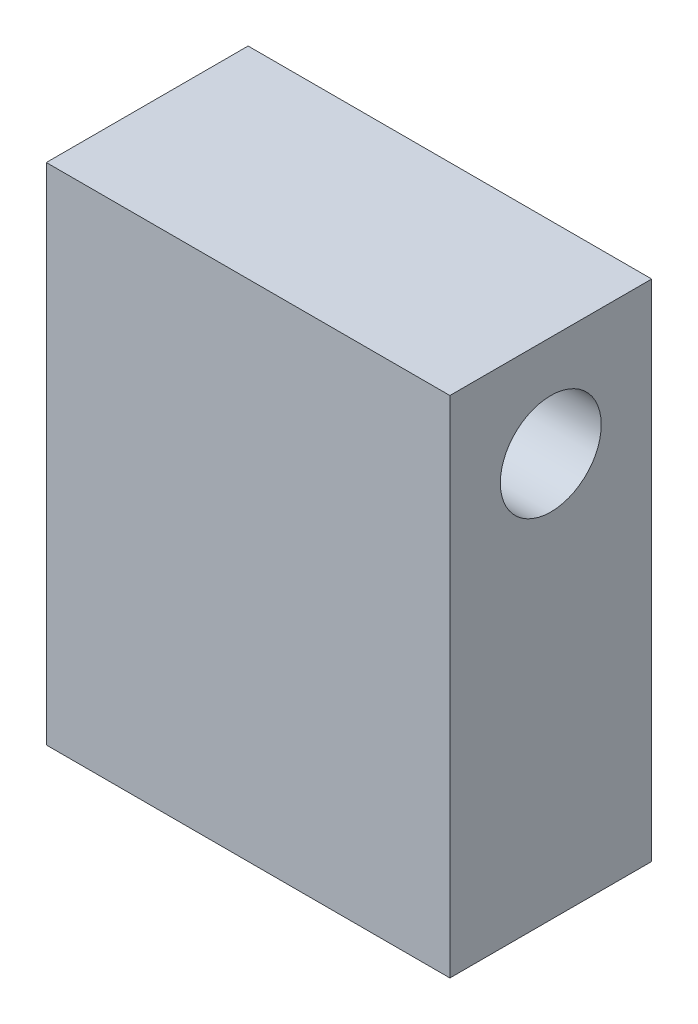
ISO-10303-21;
HEADER;
FILE_DESCRIPTION(('STEP AP214'),'2;1');
FILE_NAME('part.step','',(''),(''),'','','');
FILE_SCHEMA(('AUTOMOTIVE_DESIGN { 1 0 10303 214 1 1 1 1 }'));
ENDSEC;
DATA;
#1=APPLICATION_CONTEXT('core data for automotive mechanical design processes');
#2=APPLICATION_PROTOCOL_DEFINITION('international standard','automotive_design',2000,#1);
#3=PRODUCT_CONTEXT('',#1,'mechanical');
#4=PRODUCT('Part','Part','',(#3));
#5=PRODUCT_RELATED_PRODUCT_CATEGORY('part','',(#4));
#6=PRODUCT_DEFINITION_FORMATION('','',#4);
#7=PRODUCT_DEFINITION_CONTEXT('part definition',#1,'design');
#8=PRODUCT_DEFINITION('design','',#6,#7);
#9=PRODUCT_DEFINITION_SHAPE('','',#8);
#10=(LENGTH_UNIT() NAMED_UNIT(*) SI_UNIT(.MILLI.,.METRE.));
#11=(NAMED_UNIT(*) PLANE_ANGLE_UNIT() SI_UNIT($,.RADIAN.));
#12=(NAMED_UNIT(*) SI_UNIT($,.STERADIAN.) SOLID_ANGLE_UNIT());
#13=UNCERTAINTY_MEASURE_WITH_UNIT(LENGTH_MEASURE(1.E-05),#10,'distance_accuracy_value','');
#14=(GEOMETRIC_REPRESENTATION_CONTEXT(3) GLOBAL_UNCERTAINTY_ASSIGNED_CONTEXT((#13)) GLOBAL_UNIT_ASSIGNED_CONTEXT((#10,
#11,#12)) REPRESENTATION_CONTEXT('',''));
#15=CARTESIAN_POINT('',(0.,0.,0.));
#16=DIRECTION('',(0.,0.,1.));
#17=DIRECTION('',(1.,0.,0.));
#18=AXIS2_PLACEMENT_3D('',#15,#16,#17);
#19=CARTESIAN_POINT('',(0.,0.,0.));
#20=DIRECTION('',(0.,1.,0.));
#21=DIRECTION('',(0.,0.,1.));
#22=AXIS2_PLACEMENT_3D('',#19,#20,#21);
#23=PLANE('',#22);
#24=CARTESIAN_POINT('',(-5.,0.,0.));
#25=DIRECTION('',(0.,1.,0.));
#26=DIRECTION('',(0.,0.,1.));
#27=AXIS2_PLACEMENT_3D('',#24,#25,#26);
#28=CIRCLE('',#27,1.5);
#29=CARTESIAN_POINT('',(-5.,0.,1.5));
#30=VERTEX_POINT('',#29);
#31=EDGE_CURVE('E113',#30,#30,#28,.T.);
#32=ORIENTED_EDGE('',*,*,#31,.T.);
#33=EDGE_LOOP('',(#32));
#34=FACE_BOUND('',#33,.T.);
#35=DIRECTION('',(0.,0.,-1.));
#36=VECTOR('',#35,1.);
#37=CARTESIAN_POINT('',(10.,0.,-5.));
#38=LINE('',#37,#36);
#39=CARTESIAN_POINT('',(10.,0.,5.));
#40=VERTEX_POINT('',#39);
#41=CARTESIAN_POINT('',(10.,0.,-5.));
#42=VERTEX_POINT('',#41);
#43=EDGE_CURVE('E99',#40,#42,#38,.T.);
#44=ORIENTED_EDGE('',*,*,#43,.F.);
#45=DIRECTION('',(1.,0.,0.));
#46=VECTOR('',#45,1.);
#47=CARTESIAN_POINT('',(-9.99999999999999,0.,5.));
#48=LINE('',#47,#46);
#49=CARTESIAN_POINT('',(-9.99999999999999,0.,5.));
#50=VERTEX_POINT('',#49);
#51=EDGE_CURVE('E74',#50,#40,#48,.T.);
#52=ORIENTED_EDGE('',*,*,#51,.F.);
#53=DIRECTION('',(0.,0.,1.));
#54=VECTOR('',#53,1.);
#55=CARTESIAN_POINT('',(-10.,0.,-5.));
#56=LINE('',#55,#54);
#57=CARTESIAN_POINT('',(-10.,0.,-5.));
#58=VERTEX_POINT('',#57);
#59=EDGE_CURVE('E68',#58,#50,#56,.T.);
#60=ORIENTED_EDGE('',*,*,#59,.F.);
#61=DIRECTION('',(-1.,0.,0.));
#62=VECTOR('',#61,1.);
#63=CARTESIAN_POINT('',(-10.,0.,-5.));
#64=LINE('',#63,#62);
#65=EDGE_CURVE('E90',#42,#58,#64,.T.);
#66=ORIENTED_EDGE('',*,*,#65,.F.);
#67=EDGE_LOOP('',(#44,#52,#60,#66));
#68=FACE_BOUND('',#67,.T.);
#69=CARTESIAN_POINT('',(5.,0.,0.));
#70=DIRECTION('',(0.,1.,0.));
#71=DIRECTION('',(0.,0.,1.));
#72=AXIS2_PLACEMENT_3D('',#69,#70,#71);
#73=CIRCLE('',#72,1.5);
#74=CARTESIAN_POINT('',(5.,0.,1.5));
#75=VERTEX_POINT('',#74);
#76=EDGE_CURVE('E119',#75,#75,#73,.T.);
#77=ORIENTED_EDGE('',*,*,#76,.T.);
#78=EDGE_LOOP('',(#77));
#79=FACE_BOUND('',#78,.T.);
#80=ADVANCED_FACE('F33',(#34,#68,#79),#23,.F.);
#81=CARTESIAN_POINT('',(10.,25.,-5.));
#82=DIRECTION('',(-1.,0.,0.));
#83=DIRECTION('',(0.,0.,1.));
#84=AXIS2_PLACEMENT_3D('',#81,#82,#83);
#85=PLANE('',#84);
#86=CARTESIAN_POINT('',(10.,20.,0.));
#87=DIRECTION('',(-1.,0.,0.));
#88=DIRECTION('',(0.,0.,1.));
#89=AXIS2_PLACEMENT_3D('',#86,#87,#88);
#90=CIRCLE('',#89,2.5);
#91=CARTESIAN_POINT('',(10.,20.,2.5));
#92=VERTEX_POINT('',#91);
#93=EDGE_CURVE('E122',#92,#92,#90,.T.);
#94=ORIENTED_EDGE('',*,*,#93,.T.);
#95=EDGE_LOOP('',(#94));
#96=FACE_BOUND('',#95,.T.);
#97=ORIENTED_EDGE('',*,*,#43,.T.);
#98=DIRECTION('',(0.,-1.,0.));
#99=VECTOR('',#98,1.);
#100=CARTESIAN_POINT('',(10.,25.,-5.));
#101=LINE('',#100,#99);
#102=CARTESIAN_POINT('',(10.,25.,-5.));
#103=VERTEX_POINT('',#102);
#104=EDGE_CURVE('E11',#103,#42,#101,.T.);
#105=ORIENTED_EDGE('',*,*,#104,.F.);
#106=DIRECTION('',(0.,0.,-1.));
#107=VECTOR('',#106,1.);
#108=CARTESIAN_POINT('',(10.,25.,-5.));
#109=LINE('',#108,#107);
#110=CARTESIAN_POINT('',(10.,25.,5.));
#111=VERTEX_POINT('',#110);
#112=EDGE_CURVE('E86',#111,#103,#109,.T.);
#113=ORIENTED_EDGE('',*,*,#112,.F.);
#114=DIRECTION('',(0.,-1.,0.));
#115=VECTOR('',#114,1.);
#116=CARTESIAN_POINT('',(10.,25.,5.));
#117=LINE('',#116,#115);
#118=EDGE_CURVE('E95',#111,#40,#117,.T.);
#119=ORIENTED_EDGE('',*,*,#118,.T.);
#120=EDGE_LOOP('',(#97,#105,#113,#119));
#121=FACE_BOUND('',#120,.T.);
#122=ADVANCED_FACE('F35',(#96,#121),#85,.F.);
#123=CARTESIAN_POINT('',(-10.,25.,-5.));
#124=DIRECTION('',(0.,0.,1.));
#125=DIRECTION('',(1.,0.,0.));
#126=AXIS2_PLACEMENT_3D('',#123,#124,#125);
#127=PLANE('',#126);
#128=ORIENTED_EDGE('',*,*,#65,.T.);
#129=DIRECTION('',(0.,-1.,0.));
#130=VECTOR('',#129,1.);
#131=CARTESIAN_POINT('',(-10.,25.,-5.));
#132=LINE('',#131,#130);
#133=CARTESIAN_POINT('',(-10.,25.,-5.));
#134=VERTEX_POINT('',#133);
#135=EDGE_CURVE('E43',#134,#58,#132,.T.);
#136=ORIENTED_EDGE('',*,*,#135,.F.);
#137=DIRECTION('',(-1.,0.,0.));
#138=VECTOR('',#137,1.);
#139=CARTESIAN_POINT('',(-10.,25.,-5.));
#140=LINE('',#139,#138);
#141=EDGE_CURVE('E81',#103,#134,#140,.T.);
#142=ORIENTED_EDGE('',*,*,#141,.F.);
#143=ORIENTED_EDGE('',*,*,#104,.T.);
#144=EDGE_LOOP('',(#128,#136,#142,#143));
#145=FACE_BOUND('',#144,.T.);
#146=ADVANCED_FACE('F89',(#145),#127,.F.);
#147=CARTESIAN_POINT('',(-10.,25.,-5.));
#148=DIRECTION('',(1.,0.,0.));
#149=DIRECTION('',(0.,0.,-1.));
#150=AXIS2_PLACEMENT_3D('',#147,#148,#149);
#151=PLANE('',#150);
#152=CARTESIAN_POINT('',(-10.,20.,0.));
#153=DIRECTION('',(1.,0.,0.));
#154=DIRECTION('',(0.,0.,-1.));
#155=AXIS2_PLACEMENT_3D('',#152,#153,#154);
#156=CIRCLE('',#155,2.5);
#157=CARTESIAN_POINT('',(-10.,20.,-2.5));
#158=VERTEX_POINT('',#157);
#159=EDGE_CURVE('E37',#158,#158,#156,.T.);
#160=ORIENTED_EDGE('',*,*,#159,.T.);
#161=EDGE_LOOP('',(#160));
#162=FACE_BOUND('',#161,.T.);
#163=ORIENTED_EDGE('',*,*,#59,.T.);
#164=DIRECTION('',(0.,-1.,0.));
#165=VECTOR('',#164,1.);
#166=CARTESIAN_POINT('',(-9.99999999999999,25.,5.));
#167=LINE('',#166,#165);
#168=CARTESIAN_POINT('',(-9.99999999999999,25.,5.));
#169=VERTEX_POINT('',#168);
#170=EDGE_CURVE('E91',#169,#50,#167,.T.);
#171=ORIENTED_EDGE('',*,*,#170,.F.);
#172=DIRECTION('',(0.,0.,1.));
#173=VECTOR('',#172,1.);
#174=CARTESIAN_POINT('',(-10.,25.,-5.));
#175=LINE('',#174,#173);
#176=EDGE_CURVE('E84',#134,#169,#175,.T.);
#177=ORIENTED_EDGE('',*,*,#176,.F.);
#178=ORIENTED_EDGE('',*,*,#135,.T.);
#179=EDGE_LOOP('',(#163,#171,#177,#178));
#180=FACE_BOUND('',#179,.T.);
#181=ADVANCED_FACE('F93',(#162,#180),#151,.F.);
#182=CARTESIAN_POINT('',(-9.99999999999999,25.,5.));
#183=DIRECTION('',(0.,0.,-1.));
#184=DIRECTION('',(-1.,0.,0.));
#185=AXIS2_PLACEMENT_3D('',#182,#183,#184);
#186=PLANE('',#185);
#187=ORIENTED_EDGE('',*,*,#51,.T.);
#188=ORIENTED_EDGE('',*,*,#118,.F.);
#189=DIRECTION('',(1.,0.,0.));
#190=VECTOR('',#189,1.);
#191=CARTESIAN_POINT('',(-9.99999999999999,25.,5.));
#192=LINE('',#191,#190);
#193=EDGE_CURVE('E51',#169,#111,#192,.T.);
#194=ORIENTED_EDGE('',*,*,#193,.F.);
#195=ORIENTED_EDGE('',*,*,#170,.T.);
#196=EDGE_LOOP('',(#187,#188,#194,#195));
#197=FACE_BOUND('',#196,.T.);
#198=ADVANCED_FACE('F107',(#197),#186,.F.);
#199=CARTESIAN_POINT('',(0.,25.,0.));
#200=DIRECTION('',(0.,1.,0.));
#201=DIRECTION('',(0.,0.,1.));
#202=AXIS2_PLACEMENT_3D('',#199,#200,#201);
#203=PLANE('',#202);
#204=ORIENTED_EDGE('',*,*,#112,.T.);
#205=ORIENTED_EDGE('',*,*,#141,.T.);
#206=ORIENTED_EDGE('',*,*,#176,.T.);
#207=ORIENTED_EDGE('',*,*,#193,.T.);
#208=EDGE_LOOP('',(#204,#205,#206,#207));
#209=FACE_BOUND('',#208,.T.);
#210=ADVANCED_FACE('F82',(#209),#203,.T.);
#211=CARTESIAN_POINT('',(-5.,10.,0.));
#212=DIRECTION('',(0.,-1.,0.));
#213=DIRECTION('',(0.,0.,-1.));
#214=AXIS2_PLACEMENT_3D('',#211,#212,#213);
#215=CYLINDRICAL_SURFACE('',#214,1.5);
#216=CARTESIAN_POINT('',(-5.,10.,0.));
#217=DIRECTION('',(0.,1.,0.));
#218=DIRECTION('',(0.,0.,1.));
#219=AXIS2_PLACEMENT_3D('',#216,#217,#218);
#220=CIRCLE('',#219,1.5);
#221=CARTESIAN_POINT('',(-5.,10.,1.5));
#222=VERTEX_POINT('',#221);
#223=EDGE_CURVE('E102',#222,#222,#220,.T.);
#224=ORIENTED_EDGE('',*,*,#223,.T.);
#225=EDGE_LOOP('',(#224));
#226=FACE_BOUND('',#225,.T.);
#227=ORIENTED_EDGE('',*,*,#31,.F.);
#228=EDGE_LOOP('',(#227));
#229=FACE_BOUND('',#228,.T.);
#230=ADVANCED_FACE('F174',(#226,#229),#215,.F.);
#231=CARTESIAN_POINT('',(-5.,10.,0.));
#232=DIRECTION('',(0.,1.,0.));
#233=DIRECTION('',(0.,0.,1.));
#234=AXIS2_PLACEMENT_3D('',#231,#232,#233);
#235=PLANE('',#234);
#236=ORIENTED_EDGE('',*,*,#223,.F.);
#237=EDGE_LOOP('',(#236));
#238=FACE_BOUND('',#237,.T.);
#239=ADVANCED_FACE('F180',(#238),#235,.F.);
#240=CARTESIAN_POINT('',(5.,10.,0.));
#241=DIRECTION('',(0.,-1.,0.));
#242=DIRECTION('',(0.,0.,-1.));
#243=AXIS2_PLACEMENT_3D('',#240,#241,#242);
#244=CYLINDRICAL_SURFACE('',#243,1.5);
#245=CARTESIAN_POINT('',(5.,10.,0.));
#246=DIRECTION('',(0.,1.,0.));
#247=DIRECTION('',(0.,0.,1.));
#248=AXIS2_PLACEMENT_3D('',#245,#246,#247);
#249=CIRCLE('',#248,1.5);
#250=CARTESIAN_POINT('',(5.,10.,1.5));
#251=VERTEX_POINT('',#250);
#252=EDGE_CURVE('E116',#251,#251,#249,.T.);
#253=ORIENTED_EDGE('',*,*,#252,.T.);
#254=EDGE_LOOP('',(#253));
#255=FACE_BOUND('',#254,.T.);
#256=ORIENTED_EDGE('',*,*,#76,.F.);
#257=EDGE_LOOP('',(#256));
#258=FACE_BOUND('',#257,.T.);
#259=ADVANCED_FACE('F140',(#255,#258),#244,.F.);
#260=CARTESIAN_POINT('',(5.,10.,0.));
#261=DIRECTION('',(0.,1.,0.));
#262=DIRECTION('',(0.,0.,1.));
#263=AXIS2_PLACEMENT_3D('',#260,#261,#262);
#264=PLANE('',#263);
#265=ORIENTED_EDGE('',*,*,#252,.F.);
#266=EDGE_LOOP('',(#265));
#267=FACE_BOUND('',#266,.T.);
#268=ADVANCED_FACE('F135',(#267),#264,.F.);
#269=CARTESIAN_POINT('',(-20.,20.,0.));
#270=DIRECTION('',(1.,0.,0.));
#271=DIRECTION('',(0.,0.,-1.));
#272=AXIS2_PLACEMENT_3D('',#269,#270,#271);
#273=CYLINDRICAL_SURFACE('',#272,2.5);
#274=ORIENTED_EDGE('',*,*,#159,.F.);
#275=EDGE_LOOP('',(#274));
#276=FACE_BOUND('',#275,.T.);
#277=ORIENTED_EDGE('',*,*,#93,.F.);
#278=EDGE_LOOP('',(#277));
#279=FACE_BOUND('',#278,.T.);
#280=ADVANCED_FACE('F132',(#276,#279),#273,.F.);
#281=CLOSED_SHELL('',(#80,#122,#146,#181,#198,#210,#230,#239,#259,#268,#280));
#282=MANIFOLD_SOLID_BREP('B2',#281);
#283=ADVANCED_BREP_SHAPE_REPRESENTATION('',(#18,#282),#14);
#284=SHAPE_DEFINITION_REPRESENTATION(#9,#283);
ENDSEC;
END-ISO-10303-21;
